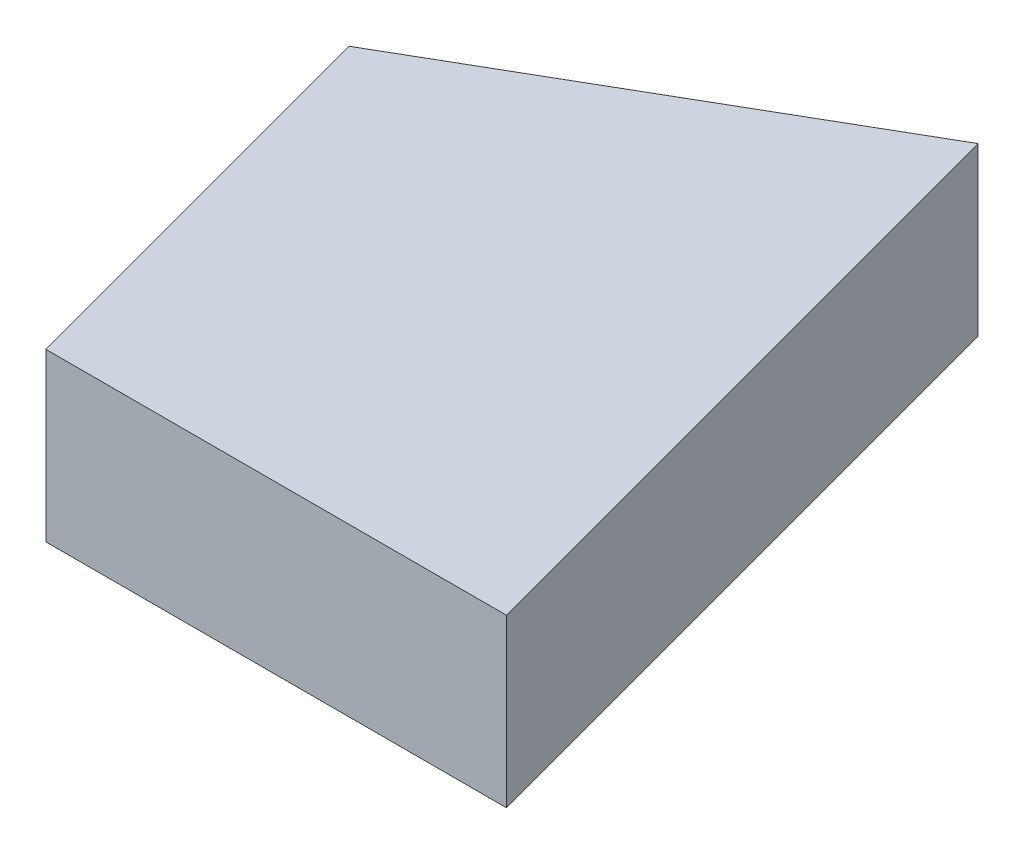
ISO-10303-21;
HEADER;
FILE_DESCRIPTION(('STEP AP214'),'2;1');
FILE_NAME('part.step','',(''),(''),'','','');
FILE_SCHEMA(('AUTOMOTIVE_DESIGN { 1 0 10303 214 1 1 1 1 }'));
ENDSEC;
DATA;
#1=APPLICATION_CONTEXT('core data for automotive mechanical design processes');
#2=APPLICATION_PROTOCOL_DEFINITION('international standard','automotive_design',2000,#1);
#3=PRODUCT_CONTEXT('',#1,'mechanical');
#4=PRODUCT('Part','Part','',(#3));
#5=PRODUCT_RELATED_PRODUCT_CATEGORY('part','',(#4));
#6=PRODUCT_DEFINITION_FORMATION('','',#4);
#7=PRODUCT_DEFINITION_CONTEXT('part definition',#1,'design');
#8=PRODUCT_DEFINITION('design','',#6,#7);
#9=PRODUCT_DEFINITION_SHAPE('','',#8);
#10=(LENGTH_UNIT() NAMED_UNIT(*) SI_UNIT(.MILLI.,.METRE.));
#11=(NAMED_UNIT(*) PLANE_ANGLE_UNIT() SI_UNIT($,.RADIAN.));
#12=(NAMED_UNIT(*) SI_UNIT($,.STERADIAN.) SOLID_ANGLE_UNIT());
#13=UNCERTAINTY_MEASURE_WITH_UNIT(LENGTH_MEASURE(1.E-05),#10,'distance_accuracy_value','');
#14=(GEOMETRIC_REPRESENTATION_CONTEXT(3) GLOBAL_UNCERTAINTY_ASSIGNED_CONTEXT((#13)) GLOBAL_UNIT_ASSIGNED_CONTEXT((#10,
#11,#12)) REPRESENTATION_CONTEXT('',''));
#15=CARTESIAN_POINT('',(0.,0.,0.));
#16=DIRECTION('',(0.,0.,1.));
#17=DIRECTION('',(1.,0.,0.));
#18=AXIS2_PLACEMENT_3D('',#15,#16,#17);
#19=CARTESIAN_POINT('',(94.6150659616216,19.05,0.));
#20=DIRECTION('',(0.,0.,-1.));
#21=DIRECTION('',(-1.,0.,0.));
#22=AXIS2_PLACEMENT_3D('',#19,#20,#21);
#23=PLANE('',#22);
#24=DIRECTION('',(1.,0.,0.));
#25=VECTOR('',#24,1.);
#26=CARTESIAN_POINT('',(94.6150659616216,0.,0.));
#27=LINE('',#26,#25);
#28=CARTESIAN_POINT('',(94.6150659616216,0.,0.));
#29=VERTEX_POINT('',#28);
#30=CARTESIAN_POINT('',(147.207095926454,0.,0.));
#31=VERTEX_POINT('',#30);
#32=EDGE_CURVE('E101',#29,#31,#27,.T.);
#33=ORIENTED_EDGE('',*,*,#32,.T.);
#34=DIRECTION('',(0.,-1.,0.));
#35=VECTOR('',#34,1.);
#36=CARTESIAN_POINT('',(147.207095926454,19.05,0.));
#37=LINE('',#36,#35);
#38=CARTESIAN_POINT('',(147.207095926454,19.05,0.));
#39=VERTEX_POINT('',#38);
#40=EDGE_CURVE('E11',#39,#31,#37,.T.);
#41=ORIENTED_EDGE('',*,*,#40,.F.);
#42=DIRECTION('',(1.,0.,0.));
#43=VECTOR('',#42,1.);
#44=CARTESIAN_POINT('',(94.6150659616216,19.05,0.));
#45=LINE('',#44,#43);
#46=CARTESIAN_POINT('',(94.6150659616216,19.05,0.));
#47=VERTEX_POINT('',#46);
#48=EDGE_CURVE('E86',#47,#39,#45,.T.);
#49=ORIENTED_EDGE('',*,*,#48,.F.);
#50=DIRECTION('',(0.,-1.,0.));
#51=VECTOR('',#50,1.);
#52=CARTESIAN_POINT('',(94.6150659616216,19.05,0.));
#53=LINE('',#52,#51);
#54=EDGE_CURVE('E97',#47,#29,#53,.T.);
#55=ORIENTED_EDGE('',*,*,#54,.T.);
#56=EDGE_LOOP('',(#33,#41,#49,#55));
#57=FACE_BOUND('',#56,.T.);
#58=ADVANCED_FACE('F34',(#57),#23,.F.);
#59=CARTESIAN_POINT('',(147.207095926454,19.05,0.));
#60=DIRECTION('',(-0.965925826289068,0.,0.258819045102521));
#61=DIRECTION('',(0.258819045102521,0.,0.965925826289068));
#62=AXIS2_PLACEMENT_3D('',#59,#60,#61);
#63=PLANE('',#62);
#64=DIRECTION('',(-0.258819045102522,0.,-0.965925826289068));
#65=VECTOR('',#64,1.);
#66=CARTESIAN_POINT('',(147.207095926454,0.,0.));
#67=LINE('',#66,#65);
#68=CARTESIAN_POINT('',(127.485084689642,0.,-73.603547963227));
#69=VERTEX_POINT('',#68);
#70=EDGE_CURVE('E91',#31,#69,#67,.T.);
#71=ORIENTED_EDGE('',*,*,#70,.T.);
#72=DIRECTION('',(0.,-1.,0.));
#73=VECTOR('',#72,1.);
#74=CARTESIAN_POINT('',(127.485084689642,19.05,-73.603547963227));
#75=LINE('',#74,#73);
#76=CARTESIAN_POINT('',(127.485084689642,19.05,-73.603547963227));
#77=VERTEX_POINT('',#76);
#78=EDGE_CURVE('E43',#77,#69,#75,.T.);
#79=ORIENTED_EDGE('',*,*,#78,.F.);
#80=DIRECTION('',(-0.258819045102522,0.,-0.965925826289068));
#81=VECTOR('',#80,1.);
#82=CARTESIAN_POINT('',(147.207095926454,19.05,0.));
#83=LINE('',#82,#81);
#84=EDGE_CURVE('E81',#39,#77,#83,.T.);
#85=ORIENTED_EDGE('',*,*,#84,.F.);
#86=ORIENTED_EDGE('',*,*,#40,.T.);
#87=EDGE_LOOP('',(#71,#79,#85,#86));
#88=FACE_BOUND('',#87,.T.);
#89=ADVANCED_FACE('F90',(#88),#63,.F.);
#90=CARTESIAN_POINT('',(127.485084689642,19.05,-73.603547963227));
#91=DIRECTION('',(0.500000000000001,0.,0.866025403784438));
#92=DIRECTION('',(0.866025403784438,0.,-0.500000000000001));
#93=AXIS2_PLACEMENT_3D('',#90,#91,#92);
#94=PLANE('',#93);
#95=DIRECTION('',(-0.866025403784438,0.,0.500000000000001));
#96=VECTOR('',#95,1.);
#97=CARTESIAN_POINT('',(127.485084689642,0.,-73.603547963227));
#98=LINE('',#97,#96);
#99=CARTESIAN_POINT('',(81.9390507035046,0.,-47.3075329808109));
#100=VERTEX_POINT('',#99);
#101=EDGE_CURVE('E68',#69,#100,#98,.T.);
#102=ORIENTED_EDGE('',*,*,#101,.T.);
#103=DIRECTION('',(0.,-1.,0.));
#104=VECTOR('',#103,1.);
#105=CARTESIAN_POINT('',(81.9390507035046,19.05,-47.3075329808109));
#106=LINE('',#105,#104);
#107=CARTESIAN_POINT('',(81.9390507035046,19.05,-47.3075329808109));
#108=VERTEX_POINT('',#107);
#109=EDGE_CURVE('E93',#108,#100,#106,.T.);
#110=ORIENTED_EDGE('',*,*,#109,.F.);
#111=DIRECTION('',(-0.866025403784438,0.,0.500000000000001));
#112=VECTOR('',#111,1.);
#113=CARTESIAN_POINT('',(127.485084689642,19.05,-73.603547963227));
#114=LINE('',#113,#112);
#115=EDGE_CURVE('E84',#77,#108,#114,.T.);
#116=ORIENTED_EDGE('',*,*,#115,.F.);
#117=ORIENTED_EDGE('',*,*,#78,.T.);
#118=EDGE_LOOP('',(#102,#110,#116,#117));
#119=FACE_BOUND('',#118,.T.);
#120=ADVANCED_FACE('F94',(#119),#94,.F.);
#121=CARTESIAN_POINT('',(94.6150659616216,19.05,0.));
#122=DIRECTION('',(0.965925826289068,0.,-0.258819045102521));
#123=DIRECTION('',(-0.258819045102521,0.,-0.965925826289068));
#124=AXIS2_PLACEMENT_3D('',#121,#122,#123);
#125=PLANE('',#124);
#126=DIRECTION('',(0.258819045102521,0.,0.965925826289068));
#127=VECTOR('',#126,1.);
#128=CARTESIAN_POINT('',(94.6150659616216,0.,0.));
#129=LINE('',#128,#127);
#130=EDGE_CURVE('E74',#100,#29,#129,.T.);
#131=ORIENTED_EDGE('',*,*,#130,.T.);
#132=ORIENTED_EDGE('',*,*,#54,.F.);
#133=DIRECTION('',(0.258819045102521,0.,0.965925826289068));
#134=VECTOR('',#133,1.);
#135=CARTESIAN_POINT('',(94.6150659616216,19.05,0.));
#136=LINE('',#135,#134);
#137=EDGE_CURVE('E51',#108,#47,#136,.T.);
#138=ORIENTED_EDGE('',*,*,#137,.F.);
#139=ORIENTED_EDGE('',*,*,#109,.T.);
#140=EDGE_LOOP('',(#131,#132,#138,#139));
#141=FACE_BOUND('',#140,.T.);
#142=ADVANCED_FACE('F110',(#141),#125,.F.);
#143=CARTESIAN_POINT('',(0.,19.05,0.));
#144=DIRECTION('',(0.,1.,0.));
#145=DIRECTION('',(0.,0.,1.));
#146=AXIS2_PLACEMENT_3D('',#143,#144,#145);
#147=PLANE('',#146);
#148=ORIENTED_EDGE('',*,*,#48,.T.);
#149=ORIENTED_EDGE('',*,*,#84,.T.);
#150=ORIENTED_EDGE('',*,*,#115,.T.);
#151=ORIENTED_EDGE('',*,*,#137,.T.);
#152=EDGE_LOOP('',(#148,#149,#150,#151));
#153=FACE_BOUND('',#152,.T.);
#154=ADVANCED_FACE('F82',(#153),#147,.T.);
#155=CARTESIAN_POINT('',(0.,0.,0.));
#156=DIRECTION('',(0.,1.,0.));
#157=DIRECTION('',(0.,0.,1.));
#158=AXIS2_PLACEMENT_3D('',#155,#156,#157);
#159=PLANE('',#158);
#160=ORIENTED_EDGE('',*,*,#32,.F.);
#161=ORIENTED_EDGE('',*,*,#130,.F.);
#162=ORIENTED_EDGE('',*,*,#101,.F.);
#163=ORIENTED_EDGE('',*,*,#70,.F.);
#164=EDGE_LOOP('',(#160,#161,#162,#163));
#165=FACE_BOUND('',#164,.T.);
#166=ADVANCED_FACE('F113',(#165),#159,.F.);
#167=CLOSED_SHELL('',(#58,#89,#120,#142,#154,#166));
#168=MANIFOLD_SOLID_BREP('B2',#167);
#169=ADVANCED_BREP_SHAPE_REPRESENTATION('',(#18,#168),#14);
#170=SHAPE_DEFINITION_REPRESENTATION(#9,#169);
ENDSEC;
END-ISO-10303-21;
